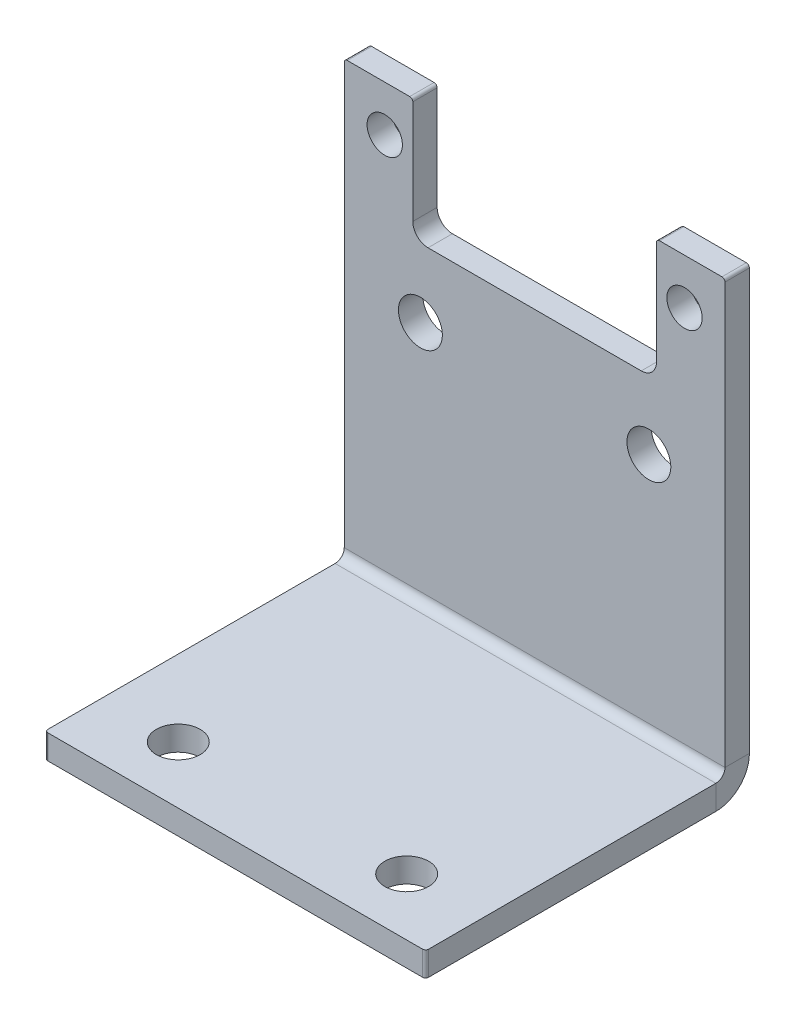
ISO-10303-21;
HEADER;
FILE_DESCRIPTION(('STEP AP214'),'2;1');
FILE_NAME('part.step','',(''),(''),'','','');
FILE_SCHEMA(('AUTOMOTIVE_DESIGN { 1 0 10303 214 1 1 1 1 }'));
ENDSEC;
DATA;
#1=APPLICATION_CONTEXT('core data for automotive mechanical design processes');
#2=APPLICATION_PROTOCOL_DEFINITION('international standard','automotive_design',2000,#1);
#3=PRODUCT_CONTEXT('',#1,'mechanical');
#4=PRODUCT('Part','Part','',(#3));
#5=PRODUCT_RELATED_PRODUCT_CATEGORY('part','',(#4));
#6=PRODUCT_DEFINITION_FORMATION('','',#4);
#7=PRODUCT_DEFINITION_CONTEXT('part definition',#1,'design');
#8=PRODUCT_DEFINITION('design','',#6,#7);
#9=PRODUCT_DEFINITION_SHAPE('','',#8);
#10=(LENGTH_UNIT() NAMED_UNIT(*) SI_UNIT(.MILLI.,.METRE.));
#11=(NAMED_UNIT(*) PLANE_ANGLE_UNIT() SI_UNIT($,.RADIAN.));
#12=(NAMED_UNIT(*) SI_UNIT($,.STERADIAN.) SOLID_ANGLE_UNIT());
#13=UNCERTAINTY_MEASURE_WITH_UNIT(LENGTH_MEASURE(1.E-05),#10,'distance_accuracy_value','');
#14=(GEOMETRIC_REPRESENTATION_CONTEXT(3) GLOBAL_UNCERTAINTY_ASSIGNED_CONTEXT((#13)) GLOBAL_UNIT_ASSIGNED_CONTEXT((#10,
#11,#12)) REPRESENTATION_CONTEXT('',''));
#15=CARTESIAN_POINT('',(0.,0.,0.));
#16=DIRECTION('',(0.,0.,1.));
#17=DIRECTION('',(1.,0.,0.));
#18=AXIS2_PLACEMENT_3D('',#15,#16,#17);
#19=CARTESIAN_POINT('',(0.,2.03200000000004,0.));
#20=DIRECTION('',(-1.,0.,0.));
#21=DIRECTION('',(0.,0.,1.));
#22=AXIS2_PLACEMENT_3D('',#19,#20,#21);
#23=PLANE('',#22);
#24=DIRECTION('',(0.,-1.,0.));
#25=VECTOR('',#24,1.);
#26=CARTESIAN_POINT('',(0.,2.03200000000004,0.));
#27=LINE('',#26,#25);
#28=CARTESIAN_POINT('',(0.,37.846,0.));
#29=VERTEX_POINT('',#28);
#30=CARTESIAN_POINT('',(0.,2.79400000000005,0.));
#31=VERTEX_POINT('',#30);
#32=EDGE_CURVE('E122',#29,#31,#27,.T.);
#33=ORIENTED_EDGE('',*,*,#32,.T.);
#34=DIRECTION('',(0.,0.,-1.));
#35=VECTOR('',#34,1.);
#36=CARTESIAN_POINT('',(0.,2.79400000000003,2.03200000000002));
#37=LINE('',#36,#35);
#38=CARTESIAN_POINT('',(0.,2.79399999999999,2.03200000195578));
#39=VERTEX_POINT('',#38);
#40=EDGE_CURVE('E235',#39,#31,#37,.T.);
#41=ORIENTED_EDGE('',*,*,#40,.F.);
#42=DIRECTION('',(0.,1.,0.));
#43=VECTOR('',#42,1.);
#44=CARTESIAN_POINT('',(0.,37.846,2.03200000000002));
#45=LINE('',#44,#43);
#46=CARTESIAN_POINT('',(0.,37.846,2.03200000000002));
#47=VERTEX_POINT('',#46);
#48=EDGE_CURVE('E237',#47,#39,#45,.F.);
#49=ORIENTED_EDGE('',*,*,#48,.F.);
#50=DIRECTION('',(0.,0.,1.));
#51=VECTOR('',#50,1.);
#52=CARTESIAN_POINT('',(0.,37.846,0.));
#53=LINE('',#52,#51);
#54=EDGE_CURVE('E260',#29,#47,#53,.T.);
#55=ORIENTED_EDGE('',*,*,#54,.F.);
#56=EDGE_LOOP('',(#33,#41,#49,#55));
#57=FACE_BOUND('',#56,.T.);
#58=ADVANCED_FACE('F100',(#57),#23,.T.);
#59=CARTESIAN_POINT('',(31.75,37.8460000000001,0.));
#60=DIRECTION('',(1.,0.,0.));
#61=DIRECTION('',(0.,1.,0.));
#62=AXIS2_PLACEMENT_3D('',#59,#60,#61);
#63=PLANE('',#62);
#64=DIRECTION('',(0.,-1.,0.));
#65=VECTOR('',#64,1.);
#66=CARTESIAN_POINT('',(31.75,37.8460000000001,2.03200000000002));
#67=LINE('',#66,#65);
#68=CARTESIAN_POINT('',(31.75,2.79400000000003,2.03200000000003));
#69=VERTEX_POINT('',#68);
#70=CARTESIAN_POINT('',(31.75,37.8460000000001,2.03200000000002));
#71=VERTEX_POINT('',#70);
#72=EDGE_CURVE('E417',#69,#71,#67,.F.);
#73=ORIENTED_EDGE('',*,*,#72,.F.);
#74=DIRECTION('',(0.,0.,-1.));
#75=VECTOR('',#74,1.);
#76=CARTESIAN_POINT('',(31.75,2.79400000000005,-2.19397928554159E-13));
#77=LINE('',#76,#75);
#78=CARTESIAN_POINT('',(31.75,2.79400000000003,0.));
#79=VERTEX_POINT('',#78);
#80=EDGE_CURVE('E13',#69,#79,#77,.T.);
#81=ORIENTED_EDGE('',*,*,#80,.T.);
#82=DIRECTION('',(0.,1.,0.));
#83=VECTOR('',#82,1.);
#84=CARTESIAN_POINT('',(31.75,37.8460000000001,0.));
#85=LINE('',#84,#83);
#86=CARTESIAN_POINT('',(31.75,37.8460000000001,0.));
#87=VERTEX_POINT('',#86);
#88=EDGE_CURVE('E115',#79,#87,#85,.T.);
#89=ORIENTED_EDGE('',*,*,#88,.T.);
#90=DIRECTION('',(0.,0.,1.));
#91=VECTOR('',#90,1.);
#92=CARTESIAN_POINT('',(31.75,37.8460000000001,0.));
#93=LINE('',#92,#91);
#94=EDGE_CURVE('E349',#87,#71,#93,.T.);
#95=ORIENTED_EDGE('',*,*,#94,.T.);
#96=EDGE_LOOP('',(#73,#81,#89,#95));
#97=FACE_BOUND('',#96,.T.);
#98=ADVANCED_FACE('F102',(#97),#63,.T.);
#99=CARTESIAN_POINT('',(0.254,37.846,0.));
#100=DIRECTION('',(0.,0.,-1.));
#101=DIRECTION('',(-1.,0.,0.));
#102=AXIS2_PLACEMENT_3D('',#99,#100,#101);
#103=PLANE('',#102);
#104=CARTESIAN_POINT('',(3.3782,34.29,0.));
#105=DIRECTION('',(0.,0.,-1.));
#106=DIRECTION('',(-1.,0.,0.));
#107=AXIS2_PLACEMENT_3D('',#104,#105,#106);
#108=CIRCLE('',#107,1.4732);
#109=CARTESIAN_POINT('',(1.905,34.29,0.));
#110=VERTEX_POINT('',#109);
#111=EDGE_CURVE('E419',#110,#110,#108,.F.);
#112=ORIENTED_EDGE('',*,*,#111,.T.);
#113=EDGE_LOOP('',(#112));
#114=FACE_BOUND('',#113,.T.);
#115=CARTESIAN_POINT('',(28.3718,34.29,0.));
#116=DIRECTION('',(0.,0.,-1.));
#117=DIRECTION('',(-1.,0.,0.));
#118=AXIS2_PLACEMENT_3D('',#115,#116,#117);
#119=CIRCLE('',#118,1.4732);
#120=CARTESIAN_POINT('',(26.8986,34.29,0.));
#121=VERTEX_POINT('',#120);
#122=EDGE_CURVE('E425',#121,#121,#119,.F.);
#123=ORIENTED_EDGE('',*,*,#122,.T.);
#124=EDGE_LOOP('',(#123));
#125=FACE_BOUND('',#124,.T.);
#126=CARTESIAN_POINT('',(6.35,22.225,0.));
#127=DIRECTION('',(0.,0.,-1.));
#128=DIRECTION('',(-1.,0.,0.));
#129=AXIS2_PLACEMENT_3D('',#126,#127,#128);
#130=CIRCLE('',#129,1.8288);
#131=CARTESIAN_POINT('',(4.5212,22.225,0.));
#132=VERTEX_POINT('',#131);
#133=EDGE_CURVE('E431',#132,#132,#130,.F.);
#134=ORIENTED_EDGE('',*,*,#133,.T.);
#135=EDGE_LOOP('',(#134));
#136=FACE_BOUND('',#135,.T.);
#137=CARTESIAN_POINT('',(25.4,22.225,0.));
#138=DIRECTION('',(0.,0.,-1.));
#139=DIRECTION('',(-1.,0.,0.));
#140=AXIS2_PLACEMENT_3D('',#137,#138,#139);
#141=CIRCLE('',#140,1.8288);
#142=CARTESIAN_POINT('',(23.5712,22.225,0.));
#143=VERTEX_POINT('',#142);
#144=EDGE_CURVE('E437',#143,#143,#141,.F.);
#145=ORIENTED_EDGE('',*,*,#144,.T.);
#146=EDGE_LOOP('',(#145));
#147=FACE_BOUND('',#146,.T.);
#148=ORIENTED_EDGE('',*,*,#88,.F.);
#149=DIRECTION('',(-1.,0.,0.));
#150=VECTOR('',#149,1.);
#151=CARTESIAN_POINT('',(0.254,2.79400000000005,0.));
#152=LINE('',#151,#150);
#153=EDGE_CURVE('E108',#79,#31,#152,.T.);
#154=ORIENTED_EDGE('',*,*,#153,.T.);
#155=ORIENTED_EDGE('',*,*,#32,.F.);
#156=CARTESIAN_POINT('',(0.254,37.846,0.));
#157=DIRECTION('',(0.,0.,-1.));
#158=DIRECTION('',(-1.,0.,0.));
#159=AXIS2_PLACEMENT_3D('',#156,#157,#158);
#160=CIRCLE('',#159,0.253999999999999);
#161=CARTESIAN_POINT('',(0.254,38.1,0.));
#162=VERTEX_POINT('',#161);
#163=EDGE_CURVE('E353',#162,#29,#160,.F.);
#164=ORIENTED_EDGE('',*,*,#163,.F.);
#165=DIRECTION('',(-1.,0.,0.));
#166=VECTOR('',#165,1.);
#167=CARTESIAN_POINT('',(0.254,38.1,0.));
#168=LINE('',#167,#166);
#169=CARTESIAN_POINT('',(5.46099999999999,38.1,0.));
#170=VERTEX_POINT('',#169);
#171=EDGE_CURVE('E356',#170,#162,#168,.T.);
#172=ORIENTED_EDGE('',*,*,#171,.F.);
#173=CARTESIAN_POINT('',(5.46099999999999,37.846,0.));
#174=DIRECTION('',(0.,0.,-1.));
#175=DIRECTION('',(-1.,0.,0.));
#176=AXIS2_PLACEMENT_3D('',#173,#174,#175);
#177=CIRCLE('',#176,0.253999999999999);
#178=CARTESIAN_POINT('',(5.71499999999999,37.846,0.));
#179=VERTEX_POINT('',#178);
#180=EDGE_CURVE('E359',#179,#170,#177,.F.);
#181=ORIENTED_EDGE('',*,*,#180,.F.);
#182=DIRECTION('',(0.,1.,0.));
#183=VECTOR('',#182,1.);
#184=CARTESIAN_POINT('',(5.71499999999999,37.846,0.));
#185=LINE('',#184,#183);
#186=CARTESIAN_POINT('',(5.715,29.21,0.));
#187=VERTEX_POINT('',#186);
#188=EDGE_CURVE('E362',#187,#179,#185,.T.);
#189=ORIENTED_EDGE('',*,*,#188,.F.);
#190=CARTESIAN_POINT('',(6.985,29.21,0.));
#191=DIRECTION('',(0.,0.,-1.));
#192=DIRECTION('',(-1.,0.,0.));
#193=AXIS2_PLACEMENT_3D('',#190,#191,#192);
#194=CIRCLE('',#193,1.27);
#195=CARTESIAN_POINT('',(6.98499999999999,27.94,0.));
#196=VERTEX_POINT('',#195);
#197=EDGE_CURVE('E365',#196,#187,#194,.T.);
#198=ORIENTED_EDGE('',*,*,#197,.F.);
#199=DIRECTION('',(-1.,0.,0.));
#200=VECTOR('',#199,1.);
#201=CARTESIAN_POINT('',(24.765,27.94,0.));
#202=LINE('',#201,#200);
#203=CARTESIAN_POINT('',(24.765,27.94,0.));
#204=VERTEX_POINT('',#203);
#205=EDGE_CURVE('E368',#204,#196,#202,.T.);
#206=ORIENTED_EDGE('',*,*,#205,.F.);
#207=CARTESIAN_POINT('',(24.765,29.21,0.));
#208=DIRECTION('',(0.,0.,-1.));
#209=DIRECTION('',(-1.,0.,0.));
#210=AXIS2_PLACEMENT_3D('',#207,#208,#209);
#211=CIRCLE('',#210,1.27);
#212=CARTESIAN_POINT('',(26.035,29.21,0.));
#213=VERTEX_POINT('',#212);
#214=EDGE_CURVE('E371',#213,#204,#211,.T.);
#215=ORIENTED_EDGE('',*,*,#214,.F.);
#216=DIRECTION('',(0.,-1.,0.));
#217=VECTOR('',#216,1.);
#218=CARTESIAN_POINT('',(26.035,37.846,0.));
#219=LINE('',#218,#217);
#220=CARTESIAN_POINT('',(26.035,37.846,0.));
#221=VERTEX_POINT('',#220);
#222=EDGE_CURVE('E374',#221,#213,#219,.T.);
#223=ORIENTED_EDGE('',*,*,#222,.F.);
#224=CARTESIAN_POINT('',(26.289,37.846,0.));
#225=DIRECTION('',(0.,0.,-1.));
#226=DIRECTION('',(-1.,0.,0.));
#227=AXIS2_PLACEMENT_3D('',#224,#225,#226);
#228=CIRCLE('',#227,0.253999999999999);
#229=CARTESIAN_POINT('',(26.289,38.1,0.));
#230=VERTEX_POINT('',#229);
#231=EDGE_CURVE('E377',#230,#221,#228,.F.);
#232=ORIENTED_EDGE('',*,*,#231,.F.);
#233=DIRECTION('',(-1.,0.,0.));
#234=VECTOR('',#233,1.);
#235=CARTESIAN_POINT('',(26.289,38.1,0.));
#236=LINE('',#235,#234);
#237=CARTESIAN_POINT('',(31.496,38.1000000000001,0.));
#238=VERTEX_POINT('',#237);
#239=EDGE_CURVE('E380',#238,#230,#236,.T.);
#240=ORIENTED_EDGE('',*,*,#239,.F.);
#241=CARTESIAN_POINT('',(31.496,37.8460000000001,0.));
#242=DIRECTION('',(0.,0.,-1.));
#243=DIRECTION('',(-1.,0.,0.));
#244=AXIS2_PLACEMENT_3D('',#241,#242,#243);
#245=CIRCLE('',#244,0.254000000000001);
#246=EDGE_CURVE('E383',#87,#238,#245,.F.);
#247=ORIENTED_EDGE('',*,*,#246,.F.);
#248=EDGE_LOOP('',(#148,#154,#155,#164,#172,#181,#189,#198,#206,#215,#223,#232,#240,#247));
#249=FACE_BOUND('',#248,.T.);
#250=ADVANCED_FACE('F442',(#114,#125,#136,#147,#249),#103,.T.);
#251=CARTESIAN_POINT('',(0.254,37.846,2.03200000000002));
#252=DIRECTION('',(0.,0.,-1.));
#253=DIRECTION('',(-1.,0.,0.));
#254=AXIS2_PLACEMENT_3D('',#251,#252,#253);
#255=PLANE('',#254);
#256=CARTESIAN_POINT('',(3.3782,34.29,2.03200000000003));
#257=DIRECTION('',(0.,0.,-1.));
#258=DIRECTION('',(-1.,0.,0.));
#259=AXIS2_PLACEMENT_3D('',#256,#257,#258);
#260=CIRCLE('',#259,1.4732);
#261=CARTESIAN_POINT('',(1.905,34.29,2.03200000000003));
#262=VERTEX_POINT('',#261);
#263=EDGE_CURVE('E422',#262,#262,#260,.F.);
#264=ORIENTED_EDGE('',*,*,#263,.F.);
#265=EDGE_LOOP('',(#264));
#266=FACE_BOUND('',#265,.T.);
#267=CARTESIAN_POINT('',(28.3718,34.29,2.03200000000003));
#268=DIRECTION('',(0.,0.,-1.));
#269=DIRECTION('',(-1.,0.,0.));
#270=AXIS2_PLACEMENT_3D('',#267,#268,#269);
#271=CIRCLE('',#270,1.4732);
#272=CARTESIAN_POINT('',(26.8986,34.29,2.03200000000003));
#273=VERTEX_POINT('',#272);
#274=EDGE_CURVE('E428',#273,#273,#271,.F.);
#275=ORIENTED_EDGE('',*,*,#274,.F.);
#276=EDGE_LOOP('',(#275));
#277=FACE_BOUND('',#276,.T.);
#278=CARTESIAN_POINT('',(6.35,22.225,2.03200000000002));
#279=DIRECTION('',(0.,0.,-1.));
#280=DIRECTION('',(-1.,0.,0.));
#281=AXIS2_PLACEMENT_3D('',#278,#279,#280);
#282=CIRCLE('',#281,1.8288);
#283=CARTESIAN_POINT('',(4.5212,22.225,2.03200000000002));
#284=VERTEX_POINT('',#283);
#285=EDGE_CURVE('E434',#284,#284,#282,.F.);
#286=ORIENTED_EDGE('',*,*,#285,.F.);
#287=EDGE_LOOP('',(#286));
#288=FACE_BOUND('',#287,.T.);
#289=CARTESIAN_POINT('',(25.4,22.225,2.03200000000002));
#290=DIRECTION('',(0.,0.,-1.));
#291=DIRECTION('',(-1.,0.,0.));
#292=AXIS2_PLACEMENT_3D('',#289,#290,#291);
#293=CIRCLE('',#292,1.8288);
#294=CARTESIAN_POINT('',(23.5712,22.225,2.03200000000002));
#295=VERTEX_POINT('',#294);
#296=EDGE_CURVE('E277',#295,#295,#293,.F.);
#297=ORIENTED_EDGE('',*,*,#296,.F.);
#298=EDGE_LOOP('',(#297));
#299=FACE_BOUND('',#298,.T.);
#300=DIRECTION('',(-1.,0.,0.));
#301=VECTOR('',#300,1.);
#302=CARTESIAN_POINT('',(31.75,2.79400000000003,2.03200000000003));
#303=LINE('',#302,#301);
#304=EDGE_CURVE('E241',#69,#39,#303,.T.);
#305=ORIENTED_EDGE('',*,*,#304,.F.);
#306=ORIENTED_EDGE('',*,*,#72,.T.);
#307=CARTESIAN_POINT('',(31.496,37.8460000000001,2.03200000000002));
#308=DIRECTION('',(0.,0.,-1.));
#309=DIRECTION('',(-1.,0.,0.));
#310=AXIS2_PLACEMENT_3D('',#307,#308,#309);
#311=CIRCLE('',#310,0.254000000000001);
#312=CARTESIAN_POINT('',(31.496,38.1000000000001,2.03200000000002));
#313=VERTEX_POINT('',#312);
#314=EDGE_CURVE('E414',#71,#313,#311,.F.);
#315=ORIENTED_EDGE('',*,*,#314,.T.);
#316=DIRECTION('',(1.,0.,0.));
#317=VECTOR('',#316,1.);
#318=CARTESIAN_POINT('',(0.254,38.1,2.03200000000002));
#319=LINE('',#318,#317);
#320=CARTESIAN_POINT('',(26.289,38.1,2.03200000000002));
#321=VERTEX_POINT('',#320);
#322=EDGE_CURVE('E411',#313,#321,#319,.F.);
#323=ORIENTED_EDGE('',*,*,#322,.T.);
#324=CARTESIAN_POINT('',(26.289,37.846,2.03200000000002));
#325=DIRECTION('',(0.,0.,-1.));
#326=DIRECTION('',(-1.,0.,0.));
#327=AXIS2_PLACEMENT_3D('',#324,#325,#326);
#328=CIRCLE('',#327,0.253999999999999);
#329=CARTESIAN_POINT('',(26.035,37.846,2.03200000000002));
#330=VERTEX_POINT('',#329);
#331=EDGE_CURVE('E408',#321,#330,#328,.F.);
#332=ORIENTED_EDGE('',*,*,#331,.T.);
#333=DIRECTION('',(0.,1.,0.));
#334=VECTOR('',#333,1.);
#335=CARTESIAN_POINT('',(26.035,37.846,2.03200000000002));
#336=LINE('',#335,#334);
#337=CARTESIAN_POINT('',(26.035,29.21,2.03200000000003));
#338=VERTEX_POINT('',#337);
#339=EDGE_CURVE('E405',#330,#338,#336,.F.);
#340=ORIENTED_EDGE('',*,*,#339,.T.);
#341=CARTESIAN_POINT('',(24.765,29.21,2.03200000000003));
#342=DIRECTION('',(0.,0.,-1.));
#343=DIRECTION('',(-1.,0.,0.));
#344=AXIS2_PLACEMENT_3D('',#341,#342,#343);
#345=CIRCLE('',#344,1.27);
#346=CARTESIAN_POINT('',(24.765,27.94,2.03200000000002));
#347=VERTEX_POINT('',#346);
#348=EDGE_CURVE('E402',#338,#347,#345,.T.);
#349=ORIENTED_EDGE('',*,*,#348,.T.);
#350=DIRECTION('',(1.,0.,0.));
#351=VECTOR('',#350,1.);
#352=CARTESIAN_POINT('',(0.254000000000002,27.94,2.03200000000002));
#353=LINE('',#352,#351);
#354=CARTESIAN_POINT('',(6.98499999999999,27.94,2.03200000000002));
#355=VERTEX_POINT('',#354);
#356=EDGE_CURVE('E399',#347,#355,#353,.F.);
#357=ORIENTED_EDGE('',*,*,#356,.T.);
#358=CARTESIAN_POINT('',(6.985,29.21,2.03200000000003));
#359=DIRECTION('',(0.,0.,-1.));
#360=DIRECTION('',(-1.,0.,0.));
#361=AXIS2_PLACEMENT_3D('',#358,#359,#360);
#362=CIRCLE('',#361,1.27);
#363=CARTESIAN_POINT('',(5.715,29.21,2.03200000000003));
#364=VERTEX_POINT('',#363);
#365=EDGE_CURVE('E396',#355,#364,#362,.T.);
#366=ORIENTED_EDGE('',*,*,#365,.T.);
#367=DIRECTION('',(0.,-1.,0.));
#368=VECTOR('',#367,1.);
#369=CARTESIAN_POINT('',(5.71499999999999,37.846,2.03200000000002));
#370=LINE('',#369,#368);
#371=CARTESIAN_POINT('',(5.71499999999999,37.846,2.03200000000002));
#372=VERTEX_POINT('',#371);
#373=EDGE_CURVE('E393',#364,#372,#370,.F.);
#374=ORIENTED_EDGE('',*,*,#373,.T.);
#375=CARTESIAN_POINT('',(5.46099999999999,37.846,2.03200000000002));
#376=DIRECTION('',(0.,0.,-1.));
#377=DIRECTION('',(-1.,0.,0.));
#378=AXIS2_PLACEMENT_3D('',#375,#376,#377);
#379=CIRCLE('',#378,0.253999999999999);
#380=CARTESIAN_POINT('',(5.46099999999999,38.1,2.03200000000002));
#381=VERTEX_POINT('',#380);
#382=EDGE_CURVE('E390',#372,#381,#379,.F.);
#383=ORIENTED_EDGE('',*,*,#382,.T.);
#384=DIRECTION('',(1.,0.,0.));
#385=VECTOR('',#384,1.);
#386=CARTESIAN_POINT('',(0.254,38.1,2.03200000000002));
#387=LINE('',#386,#385);
#388=CARTESIAN_POINT('',(0.254,38.1,2.03200000000002));
#389=VERTEX_POINT('',#388);
#390=EDGE_CURVE('E388',#381,#389,#387,.F.);
#391=ORIENTED_EDGE('',*,*,#390,.T.);
#392=CARTESIAN_POINT('',(0.254,37.846,2.03200000000002));
#393=DIRECTION('',(0.,0.,-1.));
#394=DIRECTION('',(-1.,0.,0.));
#395=AXIS2_PLACEMENT_3D('',#392,#393,#394);
#396=CIRCLE('',#395,0.253999999999999);
#397=EDGE_CURVE('E250',#389,#47,#396,.F.);
#398=ORIENTED_EDGE('',*,*,#397,.T.);
#399=ORIENTED_EDGE('',*,*,#48,.T.);
#400=EDGE_LOOP('',(#305,#306,#315,#323,#332,#340,#349,#357,#366,#374,#383,#391,#398,#399));
#401=FACE_BOUND('',#400,.T.);
#402=ADVANCED_FACE('F246',(#266,#277,#288,#299,#401),#255,.F.);
#403=CARTESIAN_POINT('',(0.254,37.846,0.));
#404=DIRECTION('',(0.,0.,1.));
#405=DIRECTION('',(1.,0.,0.));
#406=AXIS2_PLACEMENT_3D('',#403,#404,#405);
#407=CYLINDRICAL_SURFACE('',#406,0.253999999999999);
#408=ORIENTED_EDGE('',*,*,#397,.F.);
#409=DIRECTION('',(0.,0.,1.));
#410=VECTOR('',#409,1.);
#411=CARTESIAN_POINT('',(0.254,38.1,0.));
#412=LINE('',#411,#410);
#413=EDGE_CURVE('E329',#162,#389,#412,.T.);
#414=ORIENTED_EDGE('',*,*,#413,.F.);
#415=ORIENTED_EDGE('',*,*,#163,.T.);
#416=ORIENTED_EDGE('',*,*,#54,.T.);
#417=EDGE_LOOP('',(#408,#414,#415,#416));
#418=FACE_BOUND('',#417,.T.);
#419=ADVANCED_FACE('F501',(#418),#407,.T.);
#420=CARTESIAN_POINT('',(0.254,38.1,0.));
#421=DIRECTION('',(0.,1.,0.));
#422=DIRECTION('',(0.,0.,1.));
#423=AXIS2_PLACEMENT_3D('',#420,#421,#422);
#424=PLANE('',#423);
#425=ORIENTED_EDGE('',*,*,#390,.F.);
#426=DIRECTION('',(0.,0.,1.));
#427=VECTOR('',#426,1.);
#428=CARTESIAN_POINT('',(5.46099999999999,38.1,0.));
#429=LINE('',#428,#427);
#430=EDGE_CURVE('E331',#170,#381,#429,.T.);
#431=ORIENTED_EDGE('',*,*,#430,.F.);
#432=ORIENTED_EDGE('',*,*,#171,.T.);
#433=ORIENTED_EDGE('',*,*,#413,.T.);
#434=EDGE_LOOP('',(#425,#431,#432,#433));
#435=FACE_BOUND('',#434,.T.);
#436=ADVANCED_FACE('F504',(#435),#424,.T.);
#437=CARTESIAN_POINT('',(5.46099999999999,37.846,0.));
#438=DIRECTION('',(0.,0.,1.));
#439=DIRECTION('',(1.,0.,0.));
#440=AXIS2_PLACEMENT_3D('',#437,#438,#439);
#441=CYLINDRICAL_SURFACE('',#440,0.253999999999999);
#442=ORIENTED_EDGE('',*,*,#382,.F.);
#443=DIRECTION('',(0.,0.,1.));
#444=VECTOR('',#443,1.);
#445=CARTESIAN_POINT('',(5.71499999999999,37.846,0.));
#446=LINE('',#445,#444);
#447=EDGE_CURVE('E333',#179,#372,#446,.T.);
#448=ORIENTED_EDGE('',*,*,#447,.F.);
#449=ORIENTED_EDGE('',*,*,#180,.T.);
#450=ORIENTED_EDGE('',*,*,#430,.T.);
#451=EDGE_LOOP('',(#442,#448,#449,#450));
#452=FACE_BOUND('',#451,.T.);
#453=ADVANCED_FACE('F508',(#452),#441,.T.);
#454=CARTESIAN_POINT('',(5.71499999999999,37.846,0.));
#455=DIRECTION('',(1.,0.,0.));
#456=DIRECTION('',(0.,1.,0.));
#457=AXIS2_PLACEMENT_3D('',#454,#455,#456);
#458=PLANE('',#457);
#459=ORIENTED_EDGE('',*,*,#373,.F.);
#460=DIRECTION('',(0.,0.,1.));
#461=VECTOR('',#460,1.);
#462=CARTESIAN_POINT('',(5.715,29.21,0.));
#463=LINE('',#462,#461);
#464=EDGE_CURVE('E335',#187,#364,#463,.T.);
#465=ORIENTED_EDGE('',*,*,#464,.F.);
#466=ORIENTED_EDGE('',*,*,#188,.T.);
#467=ORIENTED_EDGE('',*,*,#447,.T.);
#468=EDGE_LOOP('',(#459,#465,#466,#467));
#469=FACE_BOUND('',#468,.T.);
#470=ADVANCED_FACE('F512',(#469),#458,.T.);
#471=CARTESIAN_POINT('',(6.985,29.21,0.));
#472=DIRECTION('',(0.,0.,1.));
#473=DIRECTION('',(1.,0.,0.));
#474=AXIS2_PLACEMENT_3D('',#471,#472,#473);
#475=CYLINDRICAL_SURFACE('',#474,1.27);
#476=ORIENTED_EDGE('',*,*,#365,.F.);
#477=DIRECTION('',(0.,0.,1.));
#478=VECTOR('',#477,1.);
#479=CARTESIAN_POINT('',(6.98499999999999,27.94,0.));
#480=LINE('',#479,#478);
#481=EDGE_CURVE('E337',#196,#355,#480,.T.);
#482=ORIENTED_EDGE('',*,*,#481,.F.);
#483=ORIENTED_EDGE('',*,*,#197,.T.);
#484=ORIENTED_EDGE('',*,*,#464,.T.);
#485=EDGE_LOOP('',(#476,#482,#483,#484));
#486=FACE_BOUND('',#485,.T.);
#487=ADVANCED_FACE('F516',(#486),#475,.F.);
#488=CARTESIAN_POINT('',(24.765,27.94,0.));
#489=DIRECTION('',(0.,1.,0.));
#490=DIRECTION('',(-1.,0.,0.));
#491=AXIS2_PLACEMENT_3D('',#488,#489,#490);
#492=PLANE('',#491);
#493=ORIENTED_EDGE('',*,*,#356,.F.);
#494=DIRECTION('',(0.,0.,1.));
#495=VECTOR('',#494,1.);
#496=CARTESIAN_POINT('',(24.765,27.94,0.));
#497=LINE('',#496,#495);
#498=EDGE_CURVE('E339',#204,#347,#497,.T.);
#499=ORIENTED_EDGE('',*,*,#498,.F.);
#500=ORIENTED_EDGE('',*,*,#205,.T.);
#501=ORIENTED_EDGE('',*,*,#481,.T.);
#502=EDGE_LOOP('',(#493,#499,#500,#501));
#503=FACE_BOUND('',#502,.T.);
#504=ADVANCED_FACE('F520',(#503),#492,.T.);
#505=CARTESIAN_POINT('',(24.765,29.21,0.));
#506=DIRECTION('',(0.,0.,1.));
#507=DIRECTION('',(1.,0.,0.));
#508=AXIS2_PLACEMENT_3D('',#505,#506,#507);
#509=CYLINDRICAL_SURFACE('',#508,1.27);
#510=ORIENTED_EDGE('',*,*,#348,.F.);
#511=DIRECTION('',(0.,0.,1.));
#512=VECTOR('',#511,1.);
#513=CARTESIAN_POINT('',(26.035,29.21,0.));
#514=LINE('',#513,#512);
#515=EDGE_CURVE('E341',#213,#338,#514,.T.);
#516=ORIENTED_EDGE('',*,*,#515,.F.);
#517=ORIENTED_EDGE('',*,*,#214,.T.);
#518=ORIENTED_EDGE('',*,*,#498,.T.);
#519=EDGE_LOOP('',(#510,#516,#517,#518));
#520=FACE_BOUND('',#519,.T.);
#521=ADVANCED_FACE('F524',(#520),#509,.F.);
#522=CARTESIAN_POINT('',(26.035,37.846,0.));
#523=DIRECTION('',(-1.,0.,0.));
#524=DIRECTION('',(0.,0.,1.));
#525=AXIS2_PLACEMENT_3D('',#522,#523,#524);
#526=PLANE('',#525);
#527=ORIENTED_EDGE('',*,*,#339,.F.);
#528=DIRECTION('',(0.,0.,1.));
#529=VECTOR('',#528,1.);
#530=CARTESIAN_POINT('',(26.035,37.846,0.));
#531=LINE('',#530,#529);
#532=EDGE_CURVE('E343',#221,#330,#531,.T.);
#533=ORIENTED_EDGE('',*,*,#532,.F.);
#534=ORIENTED_EDGE('',*,*,#222,.T.);
#535=ORIENTED_EDGE('',*,*,#515,.T.);
#536=EDGE_LOOP('',(#527,#533,#534,#535));
#537=FACE_BOUND('',#536,.T.);
#538=ADVANCED_FACE('F528',(#537),#526,.T.);
#539=CARTESIAN_POINT('',(26.289,37.846,0.));
#540=DIRECTION('',(0.,0.,1.));
#541=DIRECTION('',(1.,0.,0.));
#542=AXIS2_PLACEMENT_3D('',#539,#540,#541);
#543=CYLINDRICAL_SURFACE('',#542,0.253999999999999);
#544=ORIENTED_EDGE('',*,*,#331,.F.);
#545=DIRECTION('',(0.,0.,1.));
#546=VECTOR('',#545,1.);
#547=CARTESIAN_POINT('',(26.289,38.1,0.));
#548=LINE('',#547,#546);
#549=EDGE_CURVE('E345',#230,#321,#548,.T.);
#550=ORIENTED_EDGE('',*,*,#549,.F.);
#551=ORIENTED_EDGE('',*,*,#231,.T.);
#552=ORIENTED_EDGE('',*,*,#532,.T.);
#553=EDGE_LOOP('',(#544,#550,#551,#552));
#554=FACE_BOUND('',#553,.T.);
#555=ADVANCED_FACE('F532',(#554),#543,.T.);
#556=CARTESIAN_POINT('',(26.289,38.1,0.));
#557=DIRECTION('',(0.,1.,0.));
#558=DIRECTION('',(-1.,0.,0.));
#559=AXIS2_PLACEMENT_3D('',#556,#557,#558);
#560=PLANE('',#559);
#561=ORIENTED_EDGE('',*,*,#322,.F.);
#562=DIRECTION('',(0.,0.,1.));
#563=VECTOR('',#562,1.);
#564=CARTESIAN_POINT('',(31.496,38.1000000000001,0.));
#565=LINE('',#564,#563);
#566=EDGE_CURVE('E347',#238,#313,#565,.T.);
#567=ORIENTED_EDGE('',*,*,#566,.F.);
#568=ORIENTED_EDGE('',*,*,#239,.T.);
#569=ORIENTED_EDGE('',*,*,#549,.T.);
#570=EDGE_LOOP('',(#561,#567,#568,#569));
#571=FACE_BOUND('',#570,.T.);
#572=ADVANCED_FACE('F536',(#571),#560,.T.);
#573=CARTESIAN_POINT('',(31.496,37.8460000000001,0.));
#574=DIRECTION('',(0.,0.,1.));
#575=DIRECTION('',(1.,0.,0.));
#576=AXIS2_PLACEMENT_3D('',#573,#574,#575);
#577=CYLINDRICAL_SURFACE('',#576,0.254000000000001);
#578=ORIENTED_EDGE('',*,*,#314,.F.);
#579=ORIENTED_EDGE('',*,*,#94,.F.);
#580=ORIENTED_EDGE('',*,*,#246,.T.);
#581=ORIENTED_EDGE('',*,*,#566,.T.);
#582=EDGE_LOOP('',(#578,#579,#580,#581));
#583=FACE_BOUND('',#582,.T.);
#584=ADVANCED_FACE('F539',(#583),#577,.T.);
#585=CARTESIAN_POINT('',(3.3782,34.29,0.));
#586=DIRECTION('',(0.,0.,1.));
#587=DIRECTION('',(1.,0.,0.));
#588=AXIS2_PLACEMENT_3D('',#585,#586,#587);
#589=CYLINDRICAL_SURFACE('',#588,1.4732);
#590=ORIENTED_EDGE('',*,*,#111,.F.);
#591=EDGE_LOOP('',(#590));
#592=FACE_BOUND('',#591,.T.);
#593=ORIENTED_EDGE('',*,*,#263,.T.);
#594=EDGE_LOOP('',(#593));
#595=FACE_BOUND('',#594,.T.);
#596=ADVANCED_FACE('F542',(#592,#595),#589,.F.);
#597=CARTESIAN_POINT('',(28.3718,34.29,0.));
#598=DIRECTION('',(0.,0.,1.));
#599=DIRECTION('',(1.,0.,0.));
#600=AXIS2_PLACEMENT_3D('',#597,#598,#599);
#601=CYLINDRICAL_SURFACE('',#600,1.4732);
#602=ORIENTED_EDGE('',*,*,#122,.F.);
#603=EDGE_LOOP('',(#602));
#604=FACE_BOUND('',#603,.T.);
#605=ORIENTED_EDGE('',*,*,#274,.T.);
#606=EDGE_LOOP('',(#605));
#607=FACE_BOUND('',#606,.T.);
#608=ADVANCED_FACE('F547',(#604,#607),#601,.F.);
#609=CARTESIAN_POINT('',(6.35,22.225,0.));
#610=DIRECTION('',(0.,0.,1.));
#611=DIRECTION('',(1.,0.,0.));
#612=AXIS2_PLACEMENT_3D('',#609,#610,#611);
#613=CYLINDRICAL_SURFACE('',#612,1.8288);
#614=ORIENTED_EDGE('',*,*,#133,.F.);
#615=EDGE_LOOP('',(#614));
#616=FACE_BOUND('',#615,.T.);
#617=ORIENTED_EDGE('',*,*,#285,.T.);
#618=EDGE_LOOP('',(#617));
#619=FACE_BOUND('',#618,.T.);
#620=ADVANCED_FACE('F488',(#616,#619),#613,.F.);
#621=CARTESIAN_POINT('',(25.4,22.225,0.));
#622=DIRECTION('',(0.,0.,1.));
#623=DIRECTION('',(1.,0.,0.));
#624=AXIS2_PLACEMENT_3D('',#621,#622,#623);
#625=CYLINDRICAL_SURFACE('',#624,1.8288);
#626=ORIENTED_EDGE('',*,*,#144,.F.);
#627=EDGE_LOOP('',(#626));
#628=FACE_BOUND('',#627,.T.);
#629=ORIENTED_EDGE('',*,*,#296,.T.);
#630=EDGE_LOOP('',(#629));
#631=FACE_BOUND('',#630,.T.);
#632=ADVANCED_FACE('F481',(#628,#631),#625,.F.);
#633=CARTESIAN_POINT('',(31.496,2.032,26.7462));
#634=DIRECTION('',(0.,-1.,0.));
#635=DIRECTION('',(0.,0.,-1.));
#636=AXIS2_PLACEMENT_3D('',#633,#634,#635);
#637=CYLINDRICAL_SURFACE('',#636,0.253999999999999);
#638=CARTESIAN_POINT('',(31.496,0.,26.7462));
#639=DIRECTION('',(0.,1.,0.));
#640=DIRECTION('',(0.,0.,1.));
#641=AXIS2_PLACEMENT_3D('',#638,#639,#640);
#642=CIRCLE('',#641,0.253999999999999);
#643=CARTESIAN_POINT('',(31.496,0.,27.0002));
#644=VERTEX_POINT('',#643);
#645=CARTESIAN_POINT('',(31.75,0.,26.7462));
#646=VERTEX_POINT('',#645);
#647=EDGE_CURVE('E323',#644,#646,#642,.T.);
#648=ORIENTED_EDGE('',*,*,#647,.T.);
#649=DIRECTION('',(0.,-1.,0.));
#650=VECTOR('',#649,1.);
#651=CARTESIAN_POINT('',(31.75,2.032,26.7462));
#652=LINE('',#651,#650);
#653=CARTESIAN_POINT('',(31.75,2.032,26.7462));
#654=VERTEX_POINT('',#653);
#655=EDGE_CURVE('E278',#654,#646,#652,.T.);
#656=ORIENTED_EDGE('',*,*,#655,.F.);
#657=CARTESIAN_POINT('',(31.496,2.032,26.7462));
#658=DIRECTION('',(0.,1.,0.));
#659=DIRECTION('',(0.,0.,1.));
#660=AXIS2_PLACEMENT_3D('',#657,#658,#659);
#661=CIRCLE('',#660,0.253999999999999);
#662=CARTESIAN_POINT('',(31.496,2.032,27.0002));
#663=VERTEX_POINT('',#662);
#664=EDGE_CURVE('E293',#663,#654,#661,.T.);
#665=ORIENTED_EDGE('',*,*,#664,.F.);
#666=DIRECTION('',(0.,-1.,0.));
#667=VECTOR('',#666,1.);
#668=CARTESIAN_POINT('',(31.496,2.032,27.0002));
#669=LINE('',#668,#667);
#670=EDGE_CURVE('E320',#663,#644,#669,.T.);
#671=ORIENTED_EDGE('',*,*,#670,.T.);
#672=EDGE_LOOP('',(#648,#656,#665,#671));
#673=FACE_BOUND('',#672,.T.);
#674=ADVANCED_FACE('F479',(#673),#637,.T.);
#675=CARTESIAN_POINT('',(0.254000000000003,2.032,27.0002));
#676=DIRECTION('',(0.,0.,-1.));
#677=DIRECTION('',(-1.,0.,0.));
#678=AXIS2_PLACEMENT_3D('',#675,#676,#677);
#679=PLANE('',#678);
#680=DIRECTION('',(1.,0.,0.));
#681=VECTOR('',#680,1.);
#682=CARTESIAN_POINT('',(0.254000000000003,0.,27.0002));
#683=LINE('',#682,#681);
#684=CARTESIAN_POINT('',(0.254000000000003,0.,27.0002));
#685=VERTEX_POINT('',#684);
#686=EDGE_CURVE('E318',#685,#644,#683,.T.);
#687=ORIENTED_EDGE('',*,*,#686,.T.);
#688=ORIENTED_EDGE('',*,*,#670,.F.);
#689=DIRECTION('',(1.,0.,0.));
#690=VECTOR('',#689,1.);
#691=CARTESIAN_POINT('',(0.254000000000003,2.032,27.0002));
#692=LINE('',#691,#690);
#693=CARTESIAN_POINT('',(0.254000000000003,2.032,27.0002));
#694=VERTEX_POINT('',#693);
#695=EDGE_CURVE('E295',#694,#663,#692,.T.);
#696=ORIENTED_EDGE('',*,*,#695,.F.);
#697=DIRECTION('',(0.,-1.,0.));
#698=VECTOR('',#697,1.);
#699=CARTESIAN_POINT('',(0.254000000000003,2.032,27.0002));
#700=LINE('',#699,#698);
#701=EDGE_CURVE('E315',#694,#685,#700,.T.);
#702=ORIENTED_EDGE('',*,*,#701,.T.);
#703=EDGE_LOOP('',(#687,#688,#696,#702));
#704=FACE_BOUND('',#703,.T.);
#705=ADVANCED_FACE('F476',(#704),#679,.F.);
#706=CARTESIAN_POINT('',(0.254000000000003,2.032,26.7462));
#707=DIRECTION('',(0.,-1.,0.));
#708=DIRECTION('',(0.,0.,-1.));
#709=AXIS2_PLACEMENT_3D('',#706,#707,#708);
#710=CYLINDRICAL_SURFACE('',#709,0.254);
#711=CARTESIAN_POINT('',(0.254000000000003,0.,26.7462));
#712=DIRECTION('',(0.,1.,0.));
#713=DIRECTION('',(0.,0.,1.));
#714=AXIS2_PLACEMENT_3D('',#711,#712,#713);
#715=CIRCLE('',#714,0.254);
#716=CARTESIAN_POINT('',(0.,0.,26.7462));
#717=VERTEX_POINT('',#716);
#718=EDGE_CURVE('E313',#717,#685,#715,.T.);
#719=ORIENTED_EDGE('',*,*,#718,.T.);
#720=ORIENTED_EDGE('',*,*,#701,.F.);
#721=CARTESIAN_POINT('',(0.254000000000003,2.032,26.7462));
#722=DIRECTION('',(0.,1.,0.));
#723=DIRECTION('',(0.,0.,1.));
#724=AXIS2_PLACEMENT_3D('',#721,#722,#723);
#725=CIRCLE('',#724,0.254);
#726=CARTESIAN_POINT('',(0.,2.032,26.7462));
#727=VERTEX_POINT('',#726);
#728=EDGE_CURVE('E297',#727,#694,#725,.T.);
#729=ORIENTED_EDGE('',*,*,#728,.F.);
#730=DIRECTION('',(0.,-1.,0.));
#731=VECTOR('',#730,1.);
#732=CARTESIAN_POINT('',(0.,2.032,26.7462));
#733=LINE('',#732,#731);
#734=EDGE_CURVE('E310',#727,#717,#733,.T.);
#735=ORIENTED_EDGE('',*,*,#734,.T.);
#736=EDGE_LOOP('',(#719,#720,#729,#735));
#737=FACE_BOUND('',#736,.T.);
#738=ADVANCED_FACE('F472',(#737),#710,.T.);
#739=CARTESIAN_POINT('',(25.4,2.032,22.225));
#740=DIRECTION('',(0.,-1.,0.));
#741=DIRECTION('',(0.,0.,-1.));
#742=AXIS2_PLACEMENT_3D('',#739,#740,#741);
#743=CYLINDRICAL_SURFACE('',#742,1.8288);
#744=CARTESIAN_POINT('',(25.4,2.032,22.225));
#745=DIRECTION('',(0.,1.,0.));
#746=DIRECTION('',(0.,0.,1.));
#747=AXIS2_PLACEMENT_3D('',#744,#745,#746);
#748=CIRCLE('',#747,1.8288);
#749=CARTESIAN_POINT('',(25.4,2.032,24.0538));
#750=VERTEX_POINT('',#749);
#751=EDGE_CURVE('E307',#750,#750,#748,.T.);
#752=ORIENTED_EDGE('',*,*,#751,.T.);
#753=EDGE_LOOP('',(#752));
#754=FACE_BOUND('',#753,.T.);
#755=CARTESIAN_POINT('',(25.4,0.,22.225));
#756=DIRECTION('',(0.,1.,0.));
#757=DIRECTION('',(0.,0.,1.));
#758=AXIS2_PLACEMENT_3D('',#755,#756,#757);
#759=CIRCLE('',#758,1.8288);
#760=CARTESIAN_POINT('',(25.4,0.,24.0538));
#761=VERTEX_POINT('',#760);
#762=EDGE_CURVE('E284',#761,#761,#759,.T.);
#763=ORIENTED_EDGE('',*,*,#762,.F.);
#764=EDGE_LOOP('',(#763));
#765=FACE_BOUND('',#764,.T.);
#766=ADVANCED_FACE('F614',(#754,#765),#743,.F.);
#767=CARTESIAN_POINT('',(6.35,2.032,22.225));
#768=DIRECTION('',(0.,-1.,0.));
#769=DIRECTION('',(0.,0.,-1.));
#770=AXIS2_PLACEMENT_3D('',#767,#768,#769);
#771=CYLINDRICAL_SURFACE('',#770,1.8288);
#772=CARTESIAN_POINT('',(6.35,2.032,22.225));
#773=DIRECTION('',(0.,1.,0.));
#774=DIRECTION('',(0.,0.,1.));
#775=AXIS2_PLACEMENT_3D('',#772,#773,#774);
#776=CIRCLE('',#775,1.8288);
#777=CARTESIAN_POINT('',(6.35,2.032,24.0538));
#778=VERTEX_POINT('',#777);
#779=EDGE_CURVE('E304',#778,#778,#776,.T.);
#780=ORIENTED_EDGE('',*,*,#779,.T.);
#781=EDGE_LOOP('',(#780));
#782=FACE_BOUND('',#781,.T.);
#783=CARTESIAN_POINT('',(6.35,0.,22.225));
#784=DIRECTION('',(0.,1.,0.));
#785=DIRECTION('',(0.,0.,1.));
#786=AXIS2_PLACEMENT_3D('',#783,#784,#785);
#787=CIRCLE('',#786,1.8288);
#788=CARTESIAN_POINT('',(6.35,0.,24.0538));
#789=VERTEX_POINT('',#788);
#790=EDGE_CURVE('E287',#789,#789,#787,.T.);
#791=ORIENTED_EDGE('',*,*,#790,.F.);
#792=EDGE_LOOP('',(#791));
#793=FACE_BOUND('',#792,.T.);
#794=ADVANCED_FACE('F610',(#782,#793),#771,.F.);
#795=CARTESIAN_POINT('',(0.254000000000003,2.032,26.7462));
#796=DIRECTION('',(0.,1.,0.));
#797=DIRECTION('',(0.,0.,1.));
#798=AXIS2_PLACEMENT_3D('',#795,#796,#797);
#799=PLANE('',#798);
#800=ORIENTED_EDGE('',*,*,#779,.F.);
#801=EDGE_LOOP('',(#800));
#802=FACE_BOUND('',#801,.T.);
#803=ORIENTED_EDGE('',*,*,#751,.F.);
#804=EDGE_LOOP('',(#803));
#805=FACE_BOUND('',#804,.T.);
#806=DIRECTION('',(0.,0.,-1.));
#807=VECTOR('',#806,1.);
#808=CARTESIAN_POINT('',(31.75,2.032,0.));
#809=LINE('',#808,#807);
#810=CARTESIAN_POINT('',(31.75,2.03200000195577,2.794));
#811=VERTEX_POINT('',#810);
#812=EDGE_CURVE('E301',#654,#811,#809,.T.);
#813=ORIENTED_EDGE('',*,*,#812,.T.);
#814=DIRECTION('',(1.,0.,0.));
#815=VECTOR('',#814,1.);
#816=CARTESIAN_POINT('',(0.,2.03199999999999,2.794));
#817=LINE('',#816,#815);
#818=CARTESIAN_POINT('',(0.,2.03200000097788,2.794));
#819=VERTEX_POINT('',#818);
#820=EDGE_CURVE('E267',#819,#811,#817,.T.);
#821=ORIENTED_EDGE('',*,*,#820,.F.);
#822=DIRECTION('',(0.,0.,1.));
#823=VECTOR('',#822,1.);
#824=CARTESIAN_POINT('',(0.,2.032,0.));
#825=LINE('',#824,#823);
#826=EDGE_CURVE('E299',#819,#727,#825,.T.);
#827=ORIENTED_EDGE('',*,*,#826,.T.);
#828=ORIENTED_EDGE('',*,*,#728,.T.);
#829=ORIENTED_EDGE('',*,*,#695,.T.);
#830=ORIENTED_EDGE('',*,*,#664,.T.);
#831=EDGE_LOOP('',(#813,#821,#827,#828,#829,#830));
#832=FACE_BOUND('',#831,.T.);
#833=ADVANCED_FACE('F469',(#802,#805,#832),#799,.T.);
#834=CARTESIAN_POINT('',(0.,2.032,0.));
#835=DIRECTION('',(1.,0.,0.));
#836=DIRECTION('',(0.,0.,-1.));
#837=AXIS2_PLACEMENT_3D('',#834,#835,#836);
#838=PLANE('',#837);
#839=DIRECTION('',(0.,-1.,0.));
#840=VECTOR('',#839,1.);
#841=CARTESIAN_POINT('',(0.,2.03199999999999,2.794));
#842=LINE('',#841,#840);
#843=CARTESIAN_POINT('',(0.,0.,2.794));
#844=VERTEX_POINT('',#843);
#845=EDGE_CURVE('E264',#819,#844,#842,.T.);
#846=ORIENTED_EDGE('',*,*,#845,.T.);
#847=DIRECTION('',(0.,0.,1.));
#848=VECTOR('',#847,1.);
#849=CARTESIAN_POINT('',(0.,0.,0.));
#850=LINE('',#849,#848);
#851=EDGE_CURVE('E290',#844,#717,#850,.T.);
#852=ORIENTED_EDGE('',*,*,#851,.T.);
#853=ORIENTED_EDGE('',*,*,#734,.F.);
#854=ORIENTED_EDGE('',*,*,#826,.F.);
#855=EDGE_LOOP('',(#846,#852,#853,#854));
#856=FACE_BOUND('',#855,.T.);
#857=ADVANCED_FACE('F466',(#856),#838,.F.);
#858=CARTESIAN_POINT('',(0.254000000000003,0.,26.7462));
#859=DIRECTION('',(0.,1.,0.));
#860=DIRECTION('',(0.,0.,1.));
#861=AXIS2_PLACEMENT_3D('',#858,#859,#860);
#862=PLANE('',#861);
#863=ORIENTED_EDGE('',*,*,#790,.T.);
#864=EDGE_LOOP('',(#863));
#865=FACE_BOUND('',#864,.T.);
#866=ORIENTED_EDGE('',*,*,#762,.T.);
#867=EDGE_LOOP('',(#866));
#868=FACE_BOUND('',#867,.T.);
#869=DIRECTION('',(1.,0.,0.));
#870=VECTOR('',#869,1.);
#871=CARTESIAN_POINT('',(0.,0.,2.794));
#872=LINE('',#871,#870);
#873=CARTESIAN_POINT('',(31.75,1.95577234962663E-09,2.794));
#874=VERTEX_POINT('',#873);
#875=EDGE_CURVE('E281',#844,#874,#872,.T.);
#876=ORIENTED_EDGE('',*,*,#875,.T.);
#877=DIRECTION('',(0.,0.,-1.));
#878=VECTOR('',#877,1.);
#879=CARTESIAN_POINT('',(31.75,0.,0.));
#880=LINE('',#879,#878);
#881=EDGE_CURVE('E274',#646,#874,#880,.T.);
#882=ORIENTED_EDGE('',*,*,#881,.F.);
#883=ORIENTED_EDGE('',*,*,#647,.F.);
#884=ORIENTED_EDGE('',*,*,#686,.F.);
#885=ORIENTED_EDGE('',*,*,#718,.F.);
#886=ORIENTED_EDGE('',*,*,#851,.F.);
#887=EDGE_LOOP('',(#876,#882,#883,#884,#885,#886));
#888=FACE_BOUND('',#887,.T.);
#889=ADVANCED_FACE('F460',(#865,#868,#888),#862,.F.);
#890=CARTESIAN_POINT('',(31.75,2.032,0.));
#891=DIRECTION('',(-1.,0.,0.));
#892=DIRECTION('',(0.,0.,1.));
#893=AXIS2_PLACEMENT_3D('',#890,#891,#892);
#894=PLANE('',#893);
#895=DIRECTION('',(0.,-1.,0.));
#896=VECTOR('',#895,1.);
#897=CARTESIAN_POINT('',(31.75,2.03199999999999,2.794));
#898=LINE('',#897,#896);
#899=EDGE_CURVE('E325',#811,#874,#898,.T.);
#900=ORIENTED_EDGE('',*,*,#899,.F.);
#901=ORIENTED_EDGE('',*,*,#812,.F.);
#902=ORIENTED_EDGE('',*,*,#655,.T.);
#903=ORIENTED_EDGE('',*,*,#881,.T.);
#904=EDGE_LOOP('',(#900,#901,#902,#903));
#905=FACE_BOUND('',#904,.T.);
#906=ADVANCED_FACE('F454',(#905),#894,.F.);
#907=CARTESIAN_POINT('',(0.,2.79399999804421,2.794));
#908=DIRECTION('',(1.,0.,0.));
#909=DIRECTION('',(0.,0.,-1.));
#910=AXIS2_PLACEMENT_3D('',#907,#908,#909);
#911=PLANE('',#910);
#912=ORIENTED_EDGE('',*,*,#40,.T.);
#913=CARTESIAN_POINT('',(0.,2.79399999999999,2.794));
#914=DIRECTION('',(-1.,0.,0.));
#915=DIRECTION('',(0.,0.,1.));
#916=AXIS2_PLACEMENT_3D('',#913,#914,#915);
#917=CIRCLE('',#916,2.79399999804422);
#918=EDGE_CURVE('E270',#31,#844,#917,.T.);
#919=ORIENTED_EDGE('',*,*,#918,.T.);
#920=ORIENTED_EDGE('',*,*,#845,.F.);
#921=CARTESIAN_POINT('',(0.,2.79399999804421,2.794));
#922=DIRECTION('',(-1.,0.,0.));
#923=DIRECTION('',(0.,0.,1.));
#924=AXIS2_PLACEMENT_3D('',#921,#922,#923);
#925=CIRCLE('',#924,0.761999997066329);
#926=EDGE_CURVE('E256',#39,#819,#925,.T.);
#927=ORIENTED_EDGE('',*,*,#926,.F.);
#928=EDGE_LOOP('',(#912,#919,#920,#927));
#929=FACE_BOUND('',#928,.T.);
#930=ADVANCED_FACE('F262',(#929),#911,.F.);
#931=CARTESIAN_POINT('',(31.75,2.79399999804421,2.794));
#932=DIRECTION('',(-1.,0.,0.));
#933=DIRECTION('',(0.,0.,1.));
#934=AXIS2_PLACEMENT_3D('',#931,#932,#933);
#935=PLANE('',#934);
#936=CARTESIAN_POINT('',(31.75,2.79399999999999,2.794));
#937=DIRECTION('',(-1.,0.,0.));
#938=DIRECTION('',(0.,0.,1.));
#939=AXIS2_PLACEMENT_3D('',#936,#937,#938);
#940=CIRCLE('',#939,2.79399999804422);
#941=EDGE_CURVE('E265',#874,#79,#940,.F.);
#942=ORIENTED_EDGE('',*,*,#941,.T.);
#943=ORIENTED_EDGE('',*,*,#80,.F.);
#944=CARTESIAN_POINT('',(31.75,2.79399999804421,2.794));
#945=DIRECTION('',(1.,0.,0.));
#946=DIRECTION('',(0.,0.,-1.));
#947=AXIS2_PLACEMENT_3D('',#944,#945,#946);
#948=CIRCLE('',#947,0.761999997066329);
#949=EDGE_CURVE('E259',#811,#69,#948,.T.);
#950=ORIENTED_EDGE('',*,*,#949,.F.);
#951=ORIENTED_EDGE('',*,*,#899,.T.);
#952=EDGE_LOOP('',(#942,#943,#950,#951));
#953=FACE_BOUND('',#952,.T.);
#954=ADVANCED_FACE('F450',(#953),#935,.F.);
#955=CARTESIAN_POINT('',(47.8123085844733,2.79399999999999,2.794));
#956=DIRECTION('',(-1.,0.,0.));
#957=DIRECTION('',(0.,0.,1.));
#958=AXIS2_PLACEMENT_3D('',#955,#956,#957);
#959=CYLINDRICAL_SURFACE('',#958,0.761999998044219);
#960=ORIENTED_EDGE('',*,*,#820,.T.);
#961=ORIENTED_EDGE('',*,*,#949,.T.);
#962=ORIENTED_EDGE('',*,*,#304,.T.);
#963=ORIENTED_EDGE('',*,*,#926,.T.);
#964=EDGE_LOOP('',(#960,#961,#962,#963));
#965=FACE_BOUND('',#964,.T.);
#966=ADVANCED_FACE('F255',(#965),#959,.F.);
#967=CARTESIAN_POINT('',(47.8123085844733,2.79399999999999,2.794));
#968=DIRECTION('',(-1.,0.,0.));
#969=DIRECTION('',(0.,0.,1.));
#970=AXIS2_PLACEMENT_3D('',#967,#968,#969);
#971=CYLINDRICAL_SURFACE('',#970,2.79399999804422);
#972=ORIENTED_EDGE('',*,*,#875,.F.);
#973=ORIENTED_EDGE('',*,*,#918,.F.);
#974=ORIENTED_EDGE('',*,*,#153,.F.);
#975=ORIENTED_EDGE('',*,*,#941,.F.);
#976=EDGE_LOOP('',(#972,#973,#974,#975));
#977=FACE_BOUND('',#976,.T.);
#978=ADVANCED_FACE('F447',(#977),#971,.T.);
#979=CLOSED_SHELL('',(#58,#98,#250,#402,#419,#436,#453,#470,#487,#504,#521,#538,#555,#572,#584,
#596,#608,#620,#632,#674,#705,#738,#766,#794,#833,#857,#889,#906,#930,#954,#966,#978));
#980=MANIFOLD_SOLID_BREP('B2',#979);
#981=ADVANCED_BREP_SHAPE_REPRESENTATION('',(#18,#980),#14);
#982=SHAPE_DEFINITION_REPRESENTATION(#9,#981);
ENDSEC;
END-ISO-10303-21;
